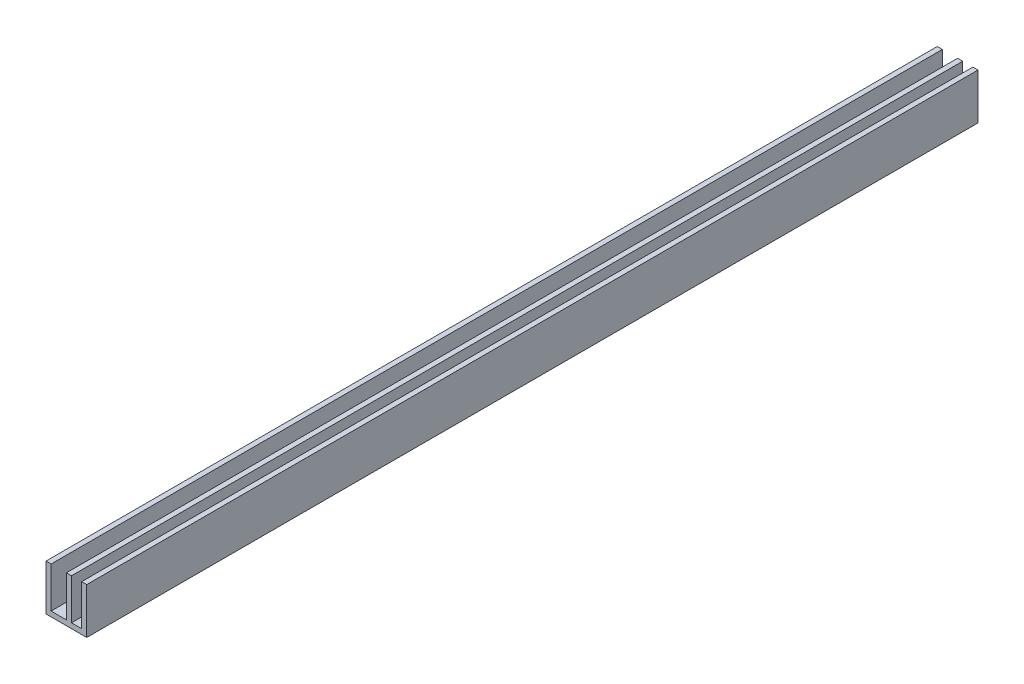
ISO-10303-21;
HEADER;
FILE_DESCRIPTION(('STEP AP214'),'2;1');
FILE_NAME('part.step','',(''),(''),'','','');
FILE_SCHEMA(('AUTOMOTIVE_DESIGN { 1 0 10303 214 1 1 1 1 }'));
ENDSEC;
DATA;
#1=APPLICATION_CONTEXT('core data for automotive mechanical design processes');
#2=APPLICATION_PROTOCOL_DEFINITION('international standard','automotive_design',2000,#1);
#3=PRODUCT_CONTEXT('',#1,'mechanical');
#4=PRODUCT('Part','Part','',(#3));
#5=PRODUCT_RELATED_PRODUCT_CATEGORY('part','',(#4));
#6=PRODUCT_DEFINITION_FORMATION('','',#4);
#7=PRODUCT_DEFINITION_CONTEXT('part definition',#1,'design');
#8=PRODUCT_DEFINITION('design','',#6,#7);
#9=PRODUCT_DEFINITION_SHAPE('','',#8);
#10=(LENGTH_UNIT() NAMED_UNIT(*) SI_UNIT(.MILLI.,.METRE.));
#11=(NAMED_UNIT(*) PLANE_ANGLE_UNIT() SI_UNIT($,.RADIAN.));
#12=(NAMED_UNIT(*) SI_UNIT($,.STERADIAN.) SOLID_ANGLE_UNIT());
#13=UNCERTAINTY_MEASURE_WITH_UNIT(LENGTH_MEASURE(1.E-05),#10,'distance_accuracy_value','');
#14=(GEOMETRIC_REPRESENTATION_CONTEXT(3) GLOBAL_UNCERTAINTY_ASSIGNED_CONTEXT((#13)) GLOBAL_UNIT_ASSIGNED_CONTEXT((#10,
#11,#12)) REPRESENTATION_CONTEXT('',''));
#15=CARTESIAN_POINT('',(0.,0.,0.));
#16=DIRECTION('',(0.,0.,1.));
#17=DIRECTION('',(1.,0.,0.));
#18=AXIS2_PLACEMENT_3D('',#15,#16,#17);
#19=CARTESIAN_POINT('',(0.,600.,17500.));
#20=DIRECTION('',(-1.,0.,0.));
#21=DIRECTION('',(0.,0.,1.));
#22=AXIS2_PLACEMENT_3D('',#19,#20,#21);
#23=PLANE('',#22);
#24=DIRECTION('',(0.,1.,0.));
#25=VECTOR('',#24,1.);
#26=CARTESIAN_POINT('',(0.,600.,0.));
#27=LINE('',#26,#25);
#28=CARTESIAN_POINT('',(0.,0.,0.));
#29=VERTEX_POINT('',#28);
#30=CARTESIAN_POINT('',(0.,900.,0.));
#31=VERTEX_POINT('',#30);
#32=EDGE_CURVE('E137',#29,#31,#27,.T.);
#33=ORIENTED_EDGE('',*,*,#32,.T.);
#34=DIRECTION('',(0.,0.,-1.));
#35=VECTOR('',#34,1.);
#36=CARTESIAN_POINT('',(0.,900.,17941.4748010929));
#37=LINE('',#36,#35);
#38=CARTESIAN_POINT('',(0.,900.,17500.));
#39=VERTEX_POINT('',#38);
#40=EDGE_CURVE('E204',#39,#31,#37,.T.);
#41=ORIENTED_EDGE('',*,*,#40,.F.);
#42=DIRECTION('',(0.,1.,0.));
#43=VECTOR('',#42,1.);
#44=CARTESIAN_POINT('',(0.,600.,17500.));
#45=LINE('',#44,#43);
#46=CARTESIAN_POINT('',(0.,0.,17500.));
#47=VERTEX_POINT('',#46);
#48=EDGE_CURVE('E155',#47,#39,#45,.T.);
#49=ORIENTED_EDGE('',*,*,#48,.F.);
#50=DIRECTION('',(0.,0.,-1.));
#51=VECTOR('',#50,1.);
#52=CARTESIAN_POINT('',(0.,0.,17500.));
#53=LINE('',#52,#51);
#54=EDGE_CURVE('E136',#47,#29,#53,.T.);
#55=ORIENTED_EDGE('',*,*,#54,.T.);
#56=EDGE_LOOP('',(#33,#41,#49,#55));
#57=FACE_BOUND('',#56,.T.);
#58=ADVANCED_FACE('F35',(#57),#23,.F.);
#59=CARTESIAN_POINT('',(-99.9999999999998,99.9999999999999,17500.));
#60=DIRECTION('',(1.,0.,0.));
#61=DIRECTION('',(0.,0.,-1.));
#62=AXIS2_PLACEMENT_3D('',#59,#60,#61);
#63=PLANE('',#62);
#64=DIRECTION('',(0.,-1.,0.));
#65=VECTOR('',#64,1.);
#66=CARTESIAN_POINT('',(-99.9999999999998,99.9999999999999,0.));
#67=LINE('',#66,#65);
#68=CARTESIAN_POINT('',(-99.9999999999998,900.,0.));
#69=VERTEX_POINT('',#68);
#70=CARTESIAN_POINT('',(-99.9999999999998,99.9999999999999,0.));
#71=VERTEX_POINT('',#70);
#72=EDGE_CURVE('E140',#69,#71,#67,.T.);
#73=ORIENTED_EDGE('',*,*,#72,.T.);
#74=DIRECTION('',(0.,0.,-1.));
#75=VECTOR('',#74,1.);
#76=CARTESIAN_POINT('',(-99.9999999999998,99.9999999999999,17500.));
#77=LINE('',#76,#75);
#78=CARTESIAN_POINT('',(-99.9999999999998,99.9999999999999,17500.));
#79=VERTEX_POINT('',#78);
#80=EDGE_CURVE('E11',#79,#71,#77,.T.);
#81=ORIENTED_EDGE('',*,*,#80,.F.);
#82=DIRECTION('',(0.,-1.,0.));
#83=VECTOR('',#82,1.);
#84=CARTESIAN_POINT('',(-99.9999999999998,99.9999999999999,17500.));
#85=LINE('',#84,#83);
#86=CARTESIAN_POINT('',(-99.9999999999998,900.,17500.));
#87=VERTEX_POINT('',#86);
#88=EDGE_CURVE('E89',#87,#79,#85,.T.);
#89=ORIENTED_EDGE('',*,*,#88,.F.);
#90=DIRECTION('',(0.,0.,-1.));
#91=VECTOR('',#90,1.);
#92=CARTESIAN_POINT('',(-99.9999999999998,900.,17941.4748010929));
#93=LINE('',#92,#91);
#94=EDGE_CURVE('E207',#87,#69,#93,.T.);
#95=ORIENTED_EDGE('',*,*,#94,.T.);
#96=EDGE_LOOP('',(#73,#81,#89,#95));
#97=FACE_BOUND('',#96,.T.);
#98=ADVANCED_FACE('F246',(#97),#63,.F.);
#99=CARTESIAN_POINT('',(-300.,99.9999999999999,17500.));
#100=DIRECTION('',(0.,-1.,0.));
#101=DIRECTION('',(1.,0.,0.));
#102=AXIS2_PLACEMENT_3D('',#99,#100,#101);
#103=PLANE('',#102);
#104=DIRECTION('',(-1.,0.,0.));
#105=VECTOR('',#104,1.);
#106=CARTESIAN_POINT('',(-300.,99.9999999999999,0.));
#107=LINE('',#106,#105);
#108=CARTESIAN_POINT('',(-300.,99.9999999999999,0.));
#109=VERTEX_POINT('',#108);
#110=EDGE_CURVE('E143',#71,#109,#107,.T.);
#111=ORIENTED_EDGE('',*,*,#110,.T.);
#112=DIRECTION('',(0.,0.,-1.));
#113=VECTOR('',#112,1.);
#114=CARTESIAN_POINT('',(-300.,99.9999999999999,17500.));
#115=LINE('',#114,#113);
#116=CARTESIAN_POINT('',(-300.,99.9999999999999,17500.));
#117=VERTEX_POINT('',#116);
#118=EDGE_CURVE('E43',#117,#109,#115,.T.);
#119=ORIENTED_EDGE('',*,*,#118,.F.);
#120=DIRECTION('',(-1.,0.,0.));
#121=VECTOR('',#120,1.);
#122=CARTESIAN_POINT('',(-300.,99.9999999999999,17500.));
#123=LINE('',#122,#121);
#124=EDGE_CURVE('E214',#79,#117,#123,.T.);
#125=ORIENTED_EDGE('',*,*,#124,.F.);
#126=ORIENTED_EDGE('',*,*,#80,.T.);
#127=EDGE_LOOP('',(#111,#119,#125,#126));
#128=FACE_BOUND('',#127,.T.);
#129=ADVANCED_FACE('F248',(#128),#103,.F.);
#130=CARTESIAN_POINT('',(-300.,470.,17500.));
#131=DIRECTION('',(-1.,0.,0.));
#132=DIRECTION('',(0.,-1.,0.));
#133=AXIS2_PLACEMENT_3D('',#130,#131,#132);
#134=PLANE('',#133);
#135=DIRECTION('',(0.,1.,0.));
#136=VECTOR('',#135,1.);
#137=CARTESIAN_POINT('',(-300.,470.,0.));
#138=LINE('',#137,#136);
#139=CARTESIAN_POINT('',(-300.,900.,0.));
#140=VERTEX_POINT('',#139);
#141=EDGE_CURVE('E145',#109,#140,#138,.T.);
#142=ORIENTED_EDGE('',*,*,#141,.T.);
#143=DIRECTION('',(0.,0.,-1.));
#144=VECTOR('',#143,1.);
#145=CARTESIAN_POINT('',(-300.,900.,17941.4748010929));
#146=LINE('',#145,#144);
#147=CARTESIAN_POINT('',(-300.,900.,17500.));
#148=VERTEX_POINT('',#147);
#149=EDGE_CURVE('E188',#148,#140,#146,.T.);
#150=ORIENTED_EDGE('',*,*,#149,.F.);
#151=DIRECTION('',(0.,1.,0.));
#152=VECTOR('',#151,1.);
#153=CARTESIAN_POINT('',(-300.,470.,17500.));
#154=LINE('',#153,#152);
#155=EDGE_CURVE('E168',#117,#148,#154,.T.);
#156=ORIENTED_EDGE('',*,*,#155,.F.);
#157=ORIENTED_EDGE('',*,*,#118,.T.);
#158=EDGE_LOOP('',(#142,#150,#156,#157));
#159=FACE_BOUND('',#158,.T.);
#160=ADVANCED_FACE('F163',(#159),#134,.F.);
#161=CARTESIAN_POINT('',(-400.,99.9999999999999,17500.));
#162=DIRECTION('',(1.,0.,0.));
#163=DIRECTION('',(0.,0.,-1.));
#164=AXIS2_PLACEMENT_3D('',#161,#162,#163);
#165=PLANE('',#164);
#166=DIRECTION('',(0.,-1.,0.));
#167=VECTOR('',#166,1.);
#168=CARTESIAN_POINT('',(-400.,99.9999999999999,0.));
#169=LINE('',#168,#167);
#170=CARTESIAN_POINT('',(-400.,900.,0.));
#171=VERTEX_POINT('',#170);
#172=CARTESIAN_POINT('',(-400.,99.9999999999999,0.));
#173=VERTEX_POINT('',#172);
#174=EDGE_CURVE('E148',#171,#173,#169,.T.);
#175=ORIENTED_EDGE('',*,*,#174,.T.);
#176=DIRECTION('',(0.,0.,-1.));
#177=VECTOR('',#176,1.);
#178=CARTESIAN_POINT('',(-400.,99.9999999999999,17500.));
#179=LINE('',#178,#177);
#180=CARTESIAN_POINT('',(-400.,99.9999999999999,17500.));
#181=VERTEX_POINT('',#180);
#182=EDGE_CURVE('E123',#181,#173,#179,.T.);
#183=ORIENTED_EDGE('',*,*,#182,.F.);
#184=DIRECTION('',(0.,-1.,0.));
#185=VECTOR('',#184,1.);
#186=CARTESIAN_POINT('',(-400.,99.9999999999999,17500.));
#187=LINE('',#186,#185);
#188=CARTESIAN_POINT('',(-400.,900.,17500.));
#189=VERTEX_POINT('',#188);
#190=EDGE_CURVE('E110',#189,#181,#187,.T.);
#191=ORIENTED_EDGE('',*,*,#190,.F.);
#192=DIRECTION('',(0.,0.,-1.));
#193=VECTOR('',#192,1.);
#194=CARTESIAN_POINT('',(-400.,900.,17941.4748010929));
#195=LINE('',#194,#193);
#196=EDGE_CURVE('E186',#189,#171,#195,.T.);
#197=ORIENTED_EDGE('',*,*,#196,.T.);
#198=EDGE_LOOP('',(#175,#183,#191,#197));
#199=FACE_BOUND('',#198,.T.);
#200=ADVANCED_FACE('F223',(#199),#165,.F.);
#201=CARTESIAN_POINT('',(-700.,99.9999999999999,17500.));
#202=DIRECTION('',(0.,-1.,0.));
#203=DIRECTION('',(1.,0.,0.));
#204=AXIS2_PLACEMENT_3D('',#201,#202,#203);
#205=PLANE('',#204);
#206=DIRECTION('',(-1.,0.,0.));
#207=VECTOR('',#206,1.);
#208=CARTESIAN_POINT('',(-700.,99.9999999999999,0.));
#209=LINE('',#208,#207);
#210=CARTESIAN_POINT('',(-700.,99.9999999999999,0.));
#211=VERTEX_POINT('',#210);
#212=EDGE_CURVE('E119',#173,#211,#209,.T.);
#213=ORIENTED_EDGE('',*,*,#212,.T.);
#214=DIRECTION('',(0.,0.,-1.));
#215=VECTOR('',#214,1.);
#216=CARTESIAN_POINT('',(-700.,99.9999999999999,17500.));
#217=LINE('',#216,#215);
#218=CARTESIAN_POINT('',(-700.,99.9999999999999,17500.));
#219=VERTEX_POINT('',#218);
#220=EDGE_CURVE('E116',#219,#211,#217,.T.);
#221=ORIENTED_EDGE('',*,*,#220,.F.);
#222=DIRECTION('',(-1.,0.,0.));
#223=VECTOR('',#222,1.);
#224=CARTESIAN_POINT('',(-700.,99.9999999999999,17500.));
#225=LINE('',#224,#223);
#226=EDGE_CURVE('E100',#181,#219,#225,.T.);
#227=ORIENTED_EDGE('',*,*,#226,.F.);
#228=ORIENTED_EDGE('',*,*,#182,.T.);
#229=EDGE_LOOP('',(#213,#221,#227,#228));
#230=FACE_BOUND('',#229,.T.);
#231=ADVANCED_FACE('F117',(#230),#205,.F.);
#232=CARTESIAN_POINT('',(-700.,600.,17500.));
#233=DIRECTION('',(-1.,0.,0.));
#234=DIRECTION('',(0.,-1.,0.));
#235=AXIS2_PLACEMENT_3D('',#232,#233,#234);
#236=PLANE('',#235);
#237=DIRECTION('',(0.,1.,0.));
#238=VECTOR('',#237,1.);
#239=CARTESIAN_POINT('',(-700.,600.,0.));
#240=LINE('',#239,#238);
#241=CARTESIAN_POINT('',(-700.,900.,0.));
#242=VERTEX_POINT('',#241);
#243=EDGE_CURVE('E151',#211,#242,#240,.T.);
#244=ORIENTED_EDGE('',*,*,#243,.T.);
#245=DIRECTION('',(0.,0.,-1.));
#246=VECTOR('',#245,1.);
#247=CARTESIAN_POINT('',(-700.,900.,17941.4748010929));
#248=LINE('',#247,#246);
#249=CARTESIAN_POINT('',(-700.,900.,17500.));
#250=VERTEX_POINT('',#249);
#251=EDGE_CURVE('E129',#250,#242,#248,.T.);
#252=ORIENTED_EDGE('',*,*,#251,.F.);
#253=DIRECTION('',(0.,1.,0.));
#254=VECTOR('',#253,1.);
#255=CARTESIAN_POINT('',(-700.,600.,17500.));
#256=LINE('',#255,#254);
#257=EDGE_CURVE('E106',#219,#250,#256,.T.);
#258=ORIENTED_EDGE('',*,*,#257,.F.);
#259=ORIENTED_EDGE('',*,*,#220,.T.);
#260=EDGE_LOOP('',(#244,#252,#258,#259));
#261=FACE_BOUND('',#260,.T.);
#262=ADVANCED_FACE('F127',(#261),#236,.F.);
#263=CARTESIAN_POINT('',(-800.,0.,17500.));
#264=DIRECTION('',(1.,0.,0.));
#265=DIRECTION('',(0.,0.,-1.));
#266=AXIS2_PLACEMENT_3D('',#263,#264,#265);
#267=PLANE('',#266);
#268=DIRECTION('',(0.,-1.,0.));
#269=VECTOR('',#268,1.);
#270=CARTESIAN_POINT('',(-800.,0.,0.));
#271=LINE('',#270,#269);
#272=CARTESIAN_POINT('',(-800.,900.,0.));
#273=VERTEX_POINT('',#272);
#274=CARTESIAN_POINT('',(-800.,0.,0.));
#275=VERTEX_POINT('',#274);
#276=EDGE_CURVE('E75',#273,#275,#271,.T.);
#277=ORIENTED_EDGE('',*,*,#276,.T.);
#278=DIRECTION('',(0.,0.,-1.));
#279=VECTOR('',#278,1.);
#280=CARTESIAN_POINT('',(-800.,0.,17500.));
#281=LINE('',#280,#279);
#282=CARTESIAN_POINT('',(-800.,0.,17500.));
#283=VERTEX_POINT('',#282);
#284=EDGE_CURVE('E124',#283,#275,#281,.T.);
#285=ORIENTED_EDGE('',*,*,#284,.F.);
#286=DIRECTION('',(0.,-1.,0.));
#287=VECTOR('',#286,1.);
#288=CARTESIAN_POINT('',(-800.,0.,17500.));
#289=LINE('',#288,#287);
#290=CARTESIAN_POINT('',(-800.,900.,17500.));
#291=VERTEX_POINT('',#290);
#292=EDGE_CURVE('E130',#291,#283,#289,.T.);
#293=ORIENTED_EDGE('',*,*,#292,.F.);
#294=DIRECTION('',(0.,0.,-1.));
#295=VECTOR('',#294,1.);
#296=CARTESIAN_POINT('',(-800.,900.,17941.4748010929));
#297=LINE('',#296,#295);
#298=EDGE_CURVE('E198',#291,#273,#297,.T.);
#299=ORIENTED_EDGE('',*,*,#298,.T.);
#300=EDGE_LOOP('',(#277,#285,#293,#299));
#301=FACE_BOUND('',#300,.T.);
#302=ADVANCED_FACE('F263',(#301),#267,.F.);
#303=CARTESIAN_POINT('',(0.,0.,17500.));
#304=DIRECTION('',(0.,1.,0.));
#305=DIRECTION('',(-1.,0.,0.));
#306=AXIS2_PLACEMENT_3D('',#303,#304,#305);
#307=PLANE('',#306);
#308=DIRECTION('',(1.,0.,0.));
#309=VECTOR('',#308,1.);
#310=CARTESIAN_POINT('',(0.,0.,0.));
#311=LINE('',#310,#309);
#312=EDGE_CURVE('E81',#275,#29,#311,.T.);
#313=ORIENTED_EDGE('',*,*,#312,.T.);
#314=ORIENTED_EDGE('',*,*,#54,.F.);
#315=DIRECTION('',(1.,0.,0.));
#316=VECTOR('',#315,1.);
#317=CARTESIAN_POINT('',(0.,0.,17500.));
#318=LINE('',#317,#316);
#319=EDGE_CURVE('E51',#283,#47,#318,.T.);
#320=ORIENTED_EDGE('',*,*,#319,.F.);
#321=ORIENTED_EDGE('',*,*,#284,.T.);
#322=EDGE_LOOP('',(#313,#314,#320,#321));
#323=FACE_BOUND('',#322,.T.);
#324=ADVANCED_FACE('F266',(#323),#307,.F.);
#325=CARTESIAN_POINT('',(0.,0.,17500.));
#326=DIRECTION('',(0.,0.,-1.));
#327=DIRECTION('',(-1.,0.,0.));
#328=AXIS2_PLACEMENT_3D('',#325,#326,#327);
#329=PLANE('',#328);
#330=ORIENTED_EDGE('',*,*,#48,.T.);
#331=DIRECTION('',(-1.,0.,0.));
#332=VECTOR('',#331,1.);
#333=CARTESIAN_POINT('',(0.,900.,17500.));
#334=LINE('',#333,#332);
#335=EDGE_CURVE('E141',#39,#87,#334,.T.);
#336=ORIENTED_EDGE('',*,*,#335,.T.);
#337=ORIENTED_EDGE('',*,*,#88,.T.);
#338=ORIENTED_EDGE('',*,*,#124,.T.);
#339=ORIENTED_EDGE('',*,*,#155,.T.);
#340=DIRECTION('',(-1.,0.,0.));
#341=VECTOR('',#340,1.);
#342=CARTESIAN_POINT('',(-300.,900.,17500.));
#343=LINE('',#342,#341);
#344=EDGE_CURVE('E191',#148,#189,#343,.T.);
#345=ORIENTED_EDGE('',*,*,#344,.T.);
#346=ORIENTED_EDGE('',*,*,#190,.T.);
#347=ORIENTED_EDGE('',*,*,#226,.T.);
#348=ORIENTED_EDGE('',*,*,#257,.T.);
#349=DIRECTION('',(-1.,0.,0.));
#350=VECTOR('',#349,1.);
#351=CARTESIAN_POINT('',(-700.,900.,17500.));
#352=LINE('',#351,#350);
#353=EDGE_CURVE('E195',#250,#291,#352,.T.);
#354=ORIENTED_EDGE('',*,*,#353,.T.);
#355=ORIENTED_EDGE('',*,*,#292,.T.);
#356=ORIENTED_EDGE('',*,*,#319,.T.);
#357=EDGE_LOOP('',(#330,#336,#337,#338,#339,#345,#346,#347,#348,#354,#355,#356));
#358=FACE_BOUND('',#357,.T.);
#359=ADVANCED_FACE('F102',(#358),#329,.F.);
#360=CARTESIAN_POINT('',(0.,0.,0.));
#361=DIRECTION('',(0.,0.,-1.));
#362=DIRECTION('',(-1.,0.,0.));
#363=AXIS2_PLACEMENT_3D('',#360,#361,#362);
#364=PLANE('',#363);
#365=ORIENTED_EDGE('',*,*,#32,.F.);
#366=ORIENTED_EDGE('',*,*,#312,.F.);
#367=ORIENTED_EDGE('',*,*,#276,.F.);
#368=DIRECTION('',(1.,0.,0.));
#369=VECTOR('',#368,1.);
#370=CARTESIAN_POINT('',(-700.,900.,0.));
#371=LINE('',#370,#369);
#372=EDGE_CURVE('E194',#273,#242,#371,.T.);
#373=ORIENTED_EDGE('',*,*,#372,.T.);
#374=ORIENTED_EDGE('',*,*,#243,.F.);
#375=ORIENTED_EDGE('',*,*,#212,.F.);
#376=ORIENTED_EDGE('',*,*,#174,.F.);
#377=DIRECTION('',(1.,0.,0.));
#378=VECTOR('',#377,1.);
#379=CARTESIAN_POINT('',(-300.,900.,0.));
#380=LINE('',#379,#378);
#381=EDGE_CURVE('E179',#171,#140,#380,.T.);
#382=ORIENTED_EDGE('',*,*,#381,.T.);
#383=ORIENTED_EDGE('',*,*,#141,.F.);
#384=ORIENTED_EDGE('',*,*,#110,.F.);
#385=ORIENTED_EDGE('',*,*,#72,.F.);
#386=DIRECTION('',(1.,0.,0.));
#387=VECTOR('',#386,1.);
#388=CARTESIAN_POINT('',(0.,900.,0.));
#389=LINE('',#388,#387);
#390=EDGE_CURVE('E197',#69,#31,#389,.T.);
#391=ORIENTED_EDGE('',*,*,#390,.T.);
#392=EDGE_LOOP('',(#365,#366,#367,#373,#374,#375,#376,#382,#383,#384,#385,#391));
#393=FACE_BOUND('',#392,.T.);
#394=ADVANCED_FACE('F175',(#393),#364,.T.);
#395=CARTESIAN_POINT('',(0.,900.,17941.4748010929));
#396=DIRECTION('',(0.,1.,0.));
#397=DIRECTION('',(0.,0.,1.));
#398=AXIS2_PLACEMENT_3D('',#395,#396,#397);
#399=PLANE('',#398);
#400=ORIENTED_EDGE('',*,*,#335,.F.);
#401=ORIENTED_EDGE('',*,*,#40,.T.);
#402=ORIENTED_EDGE('',*,*,#390,.F.);
#403=ORIENTED_EDGE('',*,*,#94,.F.);
#404=EDGE_LOOP('',(#400,#401,#402,#403));
#405=FACE_BOUND('',#404,.T.);
#406=ADVANCED_FACE('F244',(#405),#399,.T.);
#407=CARTESIAN_POINT('',(-700.,900.,17941.4748010929));
#408=DIRECTION('',(0.,1.,0.));
#409=DIRECTION('',(0.,0.,1.));
#410=AXIS2_PLACEMENT_3D('',#407,#408,#409);
#411=PLANE('',#410);
#412=ORIENTED_EDGE('',*,*,#353,.F.);
#413=ORIENTED_EDGE('',*,*,#251,.T.);
#414=ORIENTED_EDGE('',*,*,#372,.F.);
#415=ORIENTED_EDGE('',*,*,#298,.F.);
#416=EDGE_LOOP('',(#412,#413,#414,#415));
#417=FACE_BOUND('',#416,.T.);
#418=ADVANCED_FACE('F275',(#417),#411,.T.);
#419=CARTESIAN_POINT('',(-300.,900.,17941.4748010929));
#420=DIRECTION('',(0.,1.,0.));
#421=DIRECTION('',(0.,0.,1.));
#422=AXIS2_PLACEMENT_3D('',#419,#420,#421);
#423=PLANE('',#422);
#424=ORIENTED_EDGE('',*,*,#344,.F.);
#425=ORIENTED_EDGE('',*,*,#149,.T.);
#426=ORIENTED_EDGE('',*,*,#381,.F.);
#427=ORIENTED_EDGE('',*,*,#196,.F.);
#428=EDGE_LOOP('',(#424,#425,#426,#427));
#429=FACE_BOUND('',#428,.T.);
#430=ADVANCED_FACE('F219',(#429),#423,.T.);
#431=CLOSED_SHELL('',(#58,#98,#129,#160,#200,#231,#262,#302,#324,#359,#394,#406,#418,#430));
#432=MANIFOLD_SOLID_BREP('B2',#431);
#433=ADVANCED_BREP_SHAPE_REPRESENTATION('',(#18,#432),#14);
#434=SHAPE_DEFINITION_REPRESENTATION(#9,#433);
ENDSEC;
END-ISO-10303-21;
